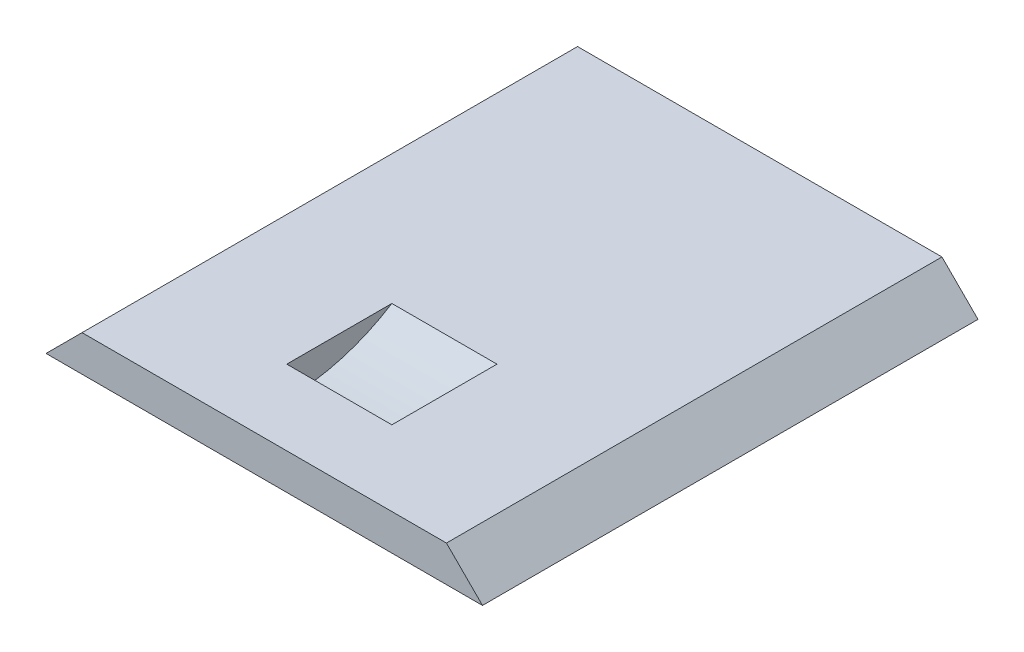
ISO-10303-21;
HEADER;
FILE_DESCRIPTION(('STEP AP214'),'2;1');
FILE_NAME('part.step','',(''),(''),'','','');
FILE_SCHEMA(('AUTOMOTIVE_DESIGN { 1 0 10303 214 1 1 1 1 }'));
ENDSEC;
DATA;
#1=APPLICATION_CONTEXT('core data for automotive mechanical design processes');
#2=APPLICATION_PROTOCOL_DEFINITION('international standard','automotive_design',2000,#1);
#3=PRODUCT_CONTEXT('',#1,'mechanical');
#4=PRODUCT('Part','Part','',(#3));
#5=PRODUCT_RELATED_PRODUCT_CATEGORY('part','',(#4));
#6=PRODUCT_DEFINITION_FORMATION('','',#4);
#7=PRODUCT_DEFINITION_CONTEXT('part definition',#1,'design');
#8=PRODUCT_DEFINITION('design','',#6,#7);
#9=PRODUCT_DEFINITION_SHAPE('','',#8);
#10=(LENGTH_UNIT() NAMED_UNIT(*) SI_UNIT(.MILLI.,.METRE.));
#11=(NAMED_UNIT(*) PLANE_ANGLE_UNIT() SI_UNIT($,.RADIAN.));
#12=(NAMED_UNIT(*) SI_UNIT($,.STERADIAN.) SOLID_ANGLE_UNIT());
#13=UNCERTAINTY_MEASURE_WITH_UNIT(LENGTH_MEASURE(1.E-05),#10,'distance_accuracy_value','');
#14=(GEOMETRIC_REPRESENTATION_CONTEXT(3) GLOBAL_UNCERTAINTY_ASSIGNED_CONTEXT((#13)) GLOBAL_UNIT_ASSIGNED_CONTEXT((#10,
#11,#12)) REPRESENTATION_CONTEXT('',''));
#15=CARTESIAN_POINT('',(0.,0.,0.));
#16=DIRECTION('',(0.,0.,1.));
#17=DIRECTION('',(1.,0.,0.));
#18=AXIS2_PLACEMENT_3D('',#15,#16,#17);
#19=CARTESIAN_POINT('',(12.1343145750508,2.8,-33.));
#20=DIRECTION('',(0.,1.,0.));
#21=DIRECTION('',(-1.,0.,0.));
#22=AXIS2_PLACEMENT_3D('',#19,#20,#21);
#23=PLANE('',#22);
#24=DIRECTION('',(0.,0.,1.));
#25=VECTOR('',#24,1.);
#26=CARTESIAN_POINT('',(-3.5,2.8,-12.));
#27=LINE('',#26,#25);
#28=CARTESIAN_POINT('',(-3.5,2.8,-12.));
#29=VERTEX_POINT('',#28);
#30=CARTESIAN_POINT('',(-3.5,2.8,-5.));
#31=VERTEX_POINT('',#30);
#32=EDGE_CURVE('E110',#29,#31,#27,.T.);
#33=ORIENTED_EDGE('',*,*,#32,.F.);
#34=DIRECTION('',(-1.,0.,0.));
#35=VECTOR('',#34,1.);
#36=CARTESIAN_POINT('',(-3.5,2.8,-12.));
#37=LINE('',#36,#35);
#38=CARTESIAN_POINT('',(3.5,2.8,-12.));
#39=VERTEX_POINT('',#38);
#40=EDGE_CURVE('E104',#39,#29,#37,.T.);
#41=ORIENTED_EDGE('',*,*,#40,.F.);
#42=DIRECTION('',(0.,0.,-1.));
#43=VECTOR('',#42,1.);
#44=CARTESIAN_POINT('',(3.5,2.8,-12.));
#45=LINE('',#44,#43);
#46=CARTESIAN_POINT('',(3.5,2.8,-5.));
#47=VERTEX_POINT('',#46);
#48=EDGE_CURVE('E124',#47,#39,#45,.T.);
#49=ORIENTED_EDGE('',*,*,#48,.F.);
#50=DIRECTION('',(1.,0.,0.));
#51=VECTOR('',#50,1.);
#52=CARTESIAN_POINT('',(-3.5,2.8,-5.));
#53=LINE('',#52,#51);
#54=EDGE_CURVE('E122',#31,#47,#53,.T.);
#55=ORIENTED_EDGE('',*,*,#54,.F.);
#56=EDGE_LOOP('',(#33,#41,#49,#55));
#57=FACE_BOUND('',#56,.T.);
#58=DIRECTION('',(-1.,0.,0.));
#59=VECTOR('',#58,1.);
#60=CARTESIAN_POINT('',(12.1343145750508,2.8,0.));
#61=LINE('',#60,#59);
#62=CARTESIAN_POINT('',(12.1343145750508,2.8,0.));
#63=VERTEX_POINT('',#62);
#64=CARTESIAN_POINT('',(-12.1343145750507,2.8,0.));
#65=VERTEX_POINT('',#64);
#66=EDGE_CURVE('E127',#63,#65,#61,.T.);
#67=ORIENTED_EDGE('',*,*,#66,.F.);
#68=DIRECTION('',(0.,0.,1.));
#69=VECTOR('',#68,1.);
#70=CARTESIAN_POINT('',(12.1343145750508,2.8,-33.));
#71=LINE('',#70,#69);
#72=CARTESIAN_POINT('',(12.1343145750508,2.8,-33.));
#73=VERTEX_POINT('',#72);
#74=EDGE_CURVE('E153',#73,#63,#71,.T.);
#75=ORIENTED_EDGE('',*,*,#74,.F.);
#76=DIRECTION('',(-1.,0.,0.));
#77=VECTOR('',#76,1.);
#78=CARTESIAN_POINT('',(12.1343145750508,2.8,-33.));
#79=LINE('',#78,#77);
#80=CARTESIAN_POINT('',(-12.1343145750507,2.8,-33.));
#81=VERTEX_POINT('',#80);
#82=EDGE_CURVE('E129',#73,#81,#79,.T.);
#83=ORIENTED_EDGE('',*,*,#82,.T.);
#84=DIRECTION('',(0.,0.,1.));
#85=VECTOR('',#84,1.);
#86=CARTESIAN_POINT('',(-12.1343145750507,2.8,-33.));
#87=LINE('',#86,#85);
#88=EDGE_CURVE('E142',#81,#65,#87,.T.);
#89=ORIENTED_EDGE('',*,*,#88,.T.);
#90=EDGE_LOOP('',(#67,#75,#83,#89));
#91=FACE_BOUND('',#90,.T.);
#92=ADVANCED_FACE('F33',(#57,#91),#23,.T.);
#93=CARTESIAN_POINT('',(14.5343145750508,0.399999999999996,-33.));
#94=DIRECTION('',(0.707106781186554,0.707106781186541,0.));
#95=DIRECTION('',(-0.707106781186541,0.707106781186554,0.));
#96=AXIS2_PLACEMENT_3D('',#93,#94,#95);
#97=PLANE('',#96);
#98=DIRECTION('',(-0.707106781186541,0.707106781186554,0.));
#99=VECTOR('',#98,1.);
#100=CARTESIAN_POINT('',(14.5343145750508,0.399999999999996,0.));
#101=LINE('',#100,#99);
#102=CARTESIAN_POINT('',(14.5343145750508,0.399999999999996,0.));
#103=VERTEX_POINT('',#102);
#104=EDGE_CURVE('E133',#103,#63,#101,.T.);
#105=ORIENTED_EDGE('',*,*,#104,.F.);
#106=DIRECTION('',(0.,0.,1.));
#107=VECTOR('',#106,1.);
#108=CARTESIAN_POINT('',(14.5343145750508,0.399999999999996,-33.));
#109=LINE('',#108,#107);
#110=CARTESIAN_POINT('',(14.5343145750508,0.399999999999996,-33.));
#111=VERTEX_POINT('',#110);
#112=EDGE_CURVE('E155',#111,#103,#109,.T.);
#113=ORIENTED_EDGE('',*,*,#112,.F.);
#114=DIRECTION('',(-0.707106781186541,0.707106781186554,0.));
#115=VECTOR('',#114,1.);
#116=CARTESIAN_POINT('',(14.5343145750508,0.399999999999996,-33.));
#117=LINE('',#116,#115);
#118=EDGE_CURVE('E139',#111,#73,#117,.T.);
#119=ORIENTED_EDGE('',*,*,#118,.T.);
#120=ORIENTED_EDGE('',*,*,#74,.T.);
#121=EDGE_LOOP('',(#105,#113,#119,#120));
#122=FACE_BOUND('',#121,.T.);
#123=ADVANCED_FACE('F170',(#122),#97,.T.);
#124=CARTESIAN_POINT('',(-14.5343145750507,0.399999999999996,-33.));
#125=DIRECTION('',(0.,-1.,0.));
#126=DIRECTION('',(0.,0.,-1.));
#127=AXIS2_PLACEMENT_3D('',#124,#125,#126);
#128=PLANE('',#127);
#129=DIRECTION('',(1.,0.,0.));
#130=VECTOR('',#129,1.);
#131=CARTESIAN_POINT('',(-14.5343145750507,0.399999999999996,0.));
#132=LINE('',#131,#130);
#133=CARTESIAN_POINT('',(-14.5343145750507,0.399999999999996,0.));
#134=VERTEX_POINT('',#133);
#135=EDGE_CURVE('E148',#134,#103,#132,.T.);
#136=ORIENTED_EDGE('',*,*,#135,.F.);
#137=DIRECTION('',(0.,0.,1.));
#138=VECTOR('',#137,1.);
#139=CARTESIAN_POINT('',(-14.5343145750507,0.399999999999996,-33.));
#140=LINE('',#139,#138);
#141=CARTESIAN_POINT('',(-14.5343145750507,0.399999999999996,-33.));
#142=VERTEX_POINT('',#141);
#143=EDGE_CURVE('E157',#142,#134,#140,.T.);
#144=ORIENTED_EDGE('',*,*,#143,.F.);
#145=DIRECTION('',(1.,0.,0.));
#146=VECTOR('',#145,1.);
#147=CARTESIAN_POINT('',(-14.5343145750507,0.399999999999996,-33.));
#148=LINE('',#147,#146);
#149=EDGE_CURVE('E136',#142,#111,#148,.T.);
#150=ORIENTED_EDGE('',*,*,#149,.T.);
#151=ORIENTED_EDGE('',*,*,#112,.T.);
#152=EDGE_LOOP('',(#136,#144,#150,#151));
#153=FACE_BOUND('',#152,.T.);
#154=ADVANCED_FACE('F174',(#153),#128,.T.);
#155=CARTESIAN_POINT('',(-12.1343145750507,2.8,-33.));
#156=DIRECTION('',(-0.707106781186541,0.707106781186554,0.));
#157=DIRECTION('',(-0.707106781186554,-0.707106781186541,0.));
#158=AXIS2_PLACEMENT_3D('',#155,#156,#157);
#159=PLANE('',#158);
#160=DIRECTION('',(-0.707106781186554,-0.707106781186541,0.));
#161=VECTOR('',#160,1.);
#162=CARTESIAN_POINT('',(-12.1343145750507,2.8,0.));
#163=LINE('',#162,#161);
#164=EDGE_CURVE('E145',#65,#134,#163,.T.);
#165=ORIENTED_EDGE('',*,*,#164,.F.);
#166=ORIENTED_EDGE('',*,*,#88,.F.);
#167=DIRECTION('',(-0.707106781186554,-0.707106781186541,0.));
#168=VECTOR('',#167,1.);
#169=CARTESIAN_POINT('',(-12.1343145750507,2.8,-33.));
#170=LINE('',#169,#168);
#171=EDGE_CURVE('E132',#81,#142,#170,.T.);
#172=ORIENTED_EDGE('',*,*,#171,.T.);
#173=ORIENTED_EDGE('',*,*,#143,.T.);
#174=EDGE_LOOP('',(#165,#166,#172,#173));
#175=FACE_BOUND('',#174,.T.);
#176=ADVANCED_FACE('F178',(#175),#159,.T.);
#177=CARTESIAN_POINT('',(0.,0.,-33.));
#178=DIRECTION('',(0.,0.,1.));
#179=DIRECTION('',(1.,0.,0.));
#180=AXIS2_PLACEMENT_3D('',#177,#178,#179);
#181=PLANE('',#180);
#182=ORIENTED_EDGE('',*,*,#82,.F.);
#183=ORIENTED_EDGE('',*,*,#118,.F.);
#184=ORIENTED_EDGE('',*,*,#149,.F.);
#185=ORIENTED_EDGE('',*,*,#171,.F.);
#186=EDGE_LOOP('',(#182,#183,#184,#185));
#187=FACE_BOUND('',#186,.T.);
#188=ADVANCED_FACE('F181',(#187),#181,.F.);
#189=CARTESIAN_POINT('',(0.,0.,0.));
#190=DIRECTION('',(0.,0.,1.));
#191=DIRECTION('',(1.,0.,0.));
#192=AXIS2_PLACEMENT_3D('',#189,#190,#191);
#193=PLANE('',#192);
#194=ORIENTED_EDGE('',*,*,#66,.T.);
#195=ORIENTED_EDGE('',*,*,#164,.T.);
#196=ORIENTED_EDGE('',*,*,#135,.T.);
#197=ORIENTED_EDGE('',*,*,#104,.T.);
#198=EDGE_LOOP('',(#194,#195,#196,#197));
#199=FACE_BOUND('',#198,.T.);
#200=ADVANCED_FACE('F186',(#199),#193,.T.);
#201=CARTESIAN_POINT('',(-3.5,0.8,-12.));
#202=DIRECTION('',(-1.,0.,0.));
#203=DIRECTION('',(0.,0.,1.));
#204=AXIS2_PLACEMENT_3D('',#201,#202,#203);
#205=PLANE('',#204);
#206=DIRECTION('',(0.,0.,1.));
#207=VECTOR('',#206,1.);
#208=CARTESIAN_POINT('',(-3.5,0.8,-12.));
#209=LINE('',#208,#207);
#210=CARTESIAN_POINT('',(-3.5,0.8,-5.07179676972449));
#211=VERTEX_POINT('',#210);
#212=CARTESIAN_POINT('',(-3.5,0.8,-5.));
#213=VERTEX_POINT('',#212);
#214=EDGE_CURVE('E97',#211,#213,#209,.T.);
#215=ORIENTED_EDGE('',*,*,#214,.F.);
#216=CARTESIAN_POINT('',(-3.5,13.8,-5.07179676972449));
#217=DIRECTION('',(-1.,0.,0.));
#218=DIRECTION('',(0.,0.,1.));
#219=AXIS2_PLACEMENT_3D('',#216,#217,#218);
#220=CIRCLE('',#219,13.);
#221=EDGE_CURVE('E41',#211,#29,#220,.F.);
#222=ORIENTED_EDGE('',*,*,#221,.T.);
#223=ORIENTED_EDGE('',*,*,#32,.T.);
#224=DIRECTION('',(0.,1.,0.));
#225=VECTOR('',#224,1.);
#226=CARTESIAN_POINT('',(-3.5,0.8,-5.));
#227=LINE('',#226,#225);
#228=EDGE_CURVE('E107',#213,#31,#227,.T.);
#229=ORIENTED_EDGE('',*,*,#228,.F.);
#230=EDGE_LOOP('',(#215,#222,#223,#229));
#231=FACE_BOUND('',#230,.T.);
#232=ADVANCED_FACE('F108',(#231),#205,.F.);
#233=CARTESIAN_POINT('',(3.5,0.800000000000001,-12.));
#234=DIRECTION('',(1.,0.,0.));
#235=DIRECTION('',(0.,0.,-1.));
#236=AXIS2_PLACEMENT_3D('',#233,#234,#235);
#237=PLANE('',#236);
#238=ORIENTED_EDGE('',*,*,#48,.T.);
#239=CARTESIAN_POINT('',(3.5,13.8,-5.07179676972449));
#240=DIRECTION('',(1.,0.,0.));
#241=DIRECTION('',(0.,0.,-1.));
#242=AXIS2_PLACEMENT_3D('',#239,#240,#241);
#243=CIRCLE('',#242,13.);
#244=CARTESIAN_POINT('',(3.5,0.8,-5.07179676972449));
#245=VERTEX_POINT('',#244);
#246=EDGE_CURVE('E11',#39,#245,#243,.F.);
#247=ORIENTED_EDGE('',*,*,#246,.T.);
#248=DIRECTION('',(0.,0.,-1.));
#249=VECTOR('',#248,1.);
#250=CARTESIAN_POINT('',(3.5,0.800000000000001,-12.));
#251=LINE('',#250,#249);
#252=CARTESIAN_POINT('',(3.5,0.800000000000001,-5.));
#253=VERTEX_POINT('',#252);
#254=EDGE_CURVE('E115',#253,#245,#251,.T.);
#255=ORIENTED_EDGE('',*,*,#254,.F.);
#256=DIRECTION('',(0.,1.,0.));
#257=VECTOR('',#256,1.);
#258=CARTESIAN_POINT('',(3.5,0.800000000000001,-5.));
#259=LINE('',#258,#257);
#260=EDGE_CURVE('E114',#253,#47,#259,.T.);
#261=ORIENTED_EDGE('',*,*,#260,.T.);
#262=EDGE_LOOP('',(#238,#247,#255,#261));
#263=FACE_BOUND('',#262,.T.);
#264=ADVANCED_FACE('F195',(#263),#237,.F.);
#265=CARTESIAN_POINT('',(-3.5,0.8,-5.));
#266=DIRECTION('',(0.,0.,1.));
#267=DIRECTION('',(1.,0.,0.));
#268=AXIS2_PLACEMENT_3D('',#265,#266,#267);
#269=PLANE('',#268);
#270=ORIENTED_EDGE('',*,*,#54,.T.);
#271=ORIENTED_EDGE('',*,*,#260,.F.);
#272=DIRECTION('',(1.,0.,0.));
#273=VECTOR('',#272,1.);
#274=CARTESIAN_POINT('',(-3.5,0.8,-5.));
#275=LINE('',#274,#273);
#276=EDGE_CURVE('E101',#213,#253,#275,.T.);
#277=ORIENTED_EDGE('',*,*,#276,.F.);
#278=ORIENTED_EDGE('',*,*,#228,.T.);
#279=EDGE_LOOP('',(#270,#271,#277,#278));
#280=FACE_BOUND('',#279,.T.);
#281=ADVANCED_FACE('F117',(#280),#269,.F.);
#282=CARTESIAN_POINT('',(0.,0.8,0.));
#283=DIRECTION('',(0.,1.,0.));
#284=DIRECTION('',(-1.,0.,0.));
#285=AXIS2_PLACEMENT_3D('',#282,#283,#284);
#286=PLANE('',#285);
#287=ORIENTED_EDGE('',*,*,#254,.T.);
#288=DIRECTION('',(-1.,0.,0.));
#289=VECTOR('',#288,1.);
#290=CARTESIAN_POINT('',(-3.5,0.8,-5.07179676972449));
#291=LINE('',#290,#289);
#292=EDGE_CURVE('E102',#245,#211,#291,.T.);
#293=ORIENTED_EDGE('',*,*,#292,.T.);
#294=ORIENTED_EDGE('',*,*,#214,.T.);
#295=ORIENTED_EDGE('',*,*,#276,.T.);
#296=EDGE_LOOP('',(#287,#293,#294,#295));
#297=FACE_BOUND('',#296,.T.);
#298=ADVANCED_FACE('F99',(#297),#286,.T.);
#299=CARTESIAN_POINT('',(-3.5,13.8,-5.07179676972449));
#300=DIRECTION('',(1.,0.,0.));
#301=DIRECTION('',(0.,1.,0.));
#302=AXIS2_PLACEMENT_3D('',#299,#300,#301);
#303=CYLINDRICAL_SURFACE('',#302,13.);
#304=ORIENTED_EDGE('',*,*,#246,.F.);
#305=ORIENTED_EDGE('',*,*,#40,.T.);
#306=ORIENTED_EDGE('',*,*,#221,.F.);
#307=ORIENTED_EDGE('',*,*,#292,.F.);
#308=EDGE_LOOP('',(#304,#305,#306,#307));
#309=FACE_BOUND('',#308,.T.);
#310=ADVANCED_FACE('F35',(#309),#303,.F.);
#311=CLOSED_SHELL('',(#92,#123,#154,#176,#188,#200,#232,#264,#281,#298,#310));
#312=MANIFOLD_SOLID_BREP('B2',#311);
#313=ADVANCED_BREP_SHAPE_REPRESENTATION('',(#18,#312),#14);
#314=SHAPE_DEFINITION_REPRESENTATION(#9,#313);
ENDSEC;
END-ISO-10303-21;
